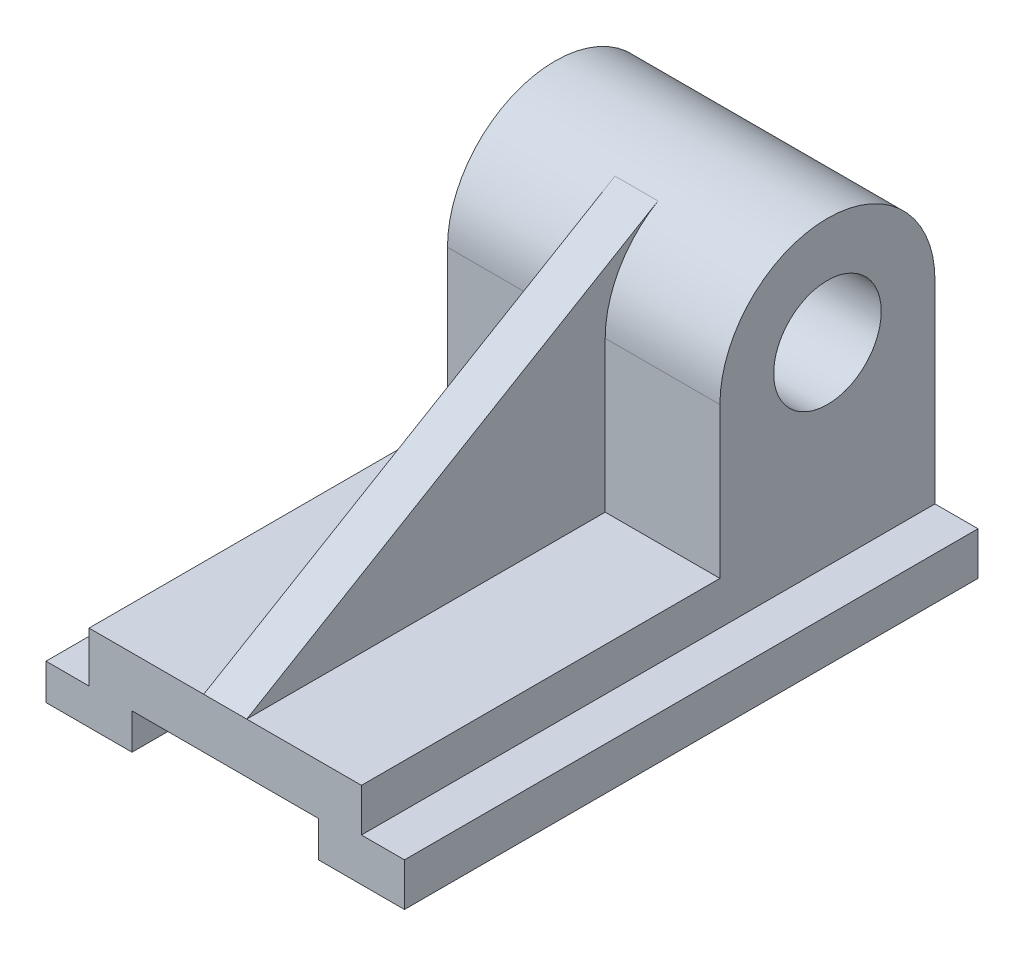
ISO-10303-21;
HEADER;
FILE_DESCRIPTION(('STEP AP214'),'2;1');
FILE_NAME('part.step','',(''),(''),'','','');
FILE_SCHEMA(('AUTOMOTIVE_DESIGN { 1 0 10303 214 1 1 1 1 }'));
ENDSEC;
DATA;
#1=APPLICATION_CONTEXT('core data for automotive mechanical design processes');
#2=APPLICATION_PROTOCOL_DEFINITION('international standard','automotive_design',2000,#1);
#3=PRODUCT_CONTEXT('',#1,'mechanical');
#4=PRODUCT('Part','Part','',(#3));
#5=PRODUCT_RELATED_PRODUCT_CATEGORY('part','',(#4));
#6=PRODUCT_DEFINITION_FORMATION('','',#4);
#7=PRODUCT_DEFINITION_CONTEXT('part definition',#1,'design');
#8=PRODUCT_DEFINITION('design','',#6,#7);
#9=PRODUCT_DEFINITION_SHAPE('','',#8);
#10=(LENGTH_UNIT() NAMED_UNIT(*) SI_UNIT(.MILLI.,.METRE.));
#11=(NAMED_UNIT(*) PLANE_ANGLE_UNIT() SI_UNIT($,.RADIAN.));
#12=(NAMED_UNIT(*) SI_UNIT($,.STERADIAN.) SOLID_ANGLE_UNIT());
#13=UNCERTAINTY_MEASURE_WITH_UNIT(LENGTH_MEASURE(1.E-05),#10,'distance_accuracy_value','');
#14=(GEOMETRIC_REPRESENTATION_CONTEXT(3) GLOBAL_UNCERTAINTY_ASSIGNED_CONTEXT((#13)) GLOBAL_UNIT_ASSIGNED_CONTEXT((#10,
#11,#12)) REPRESENTATION_CONTEXT('',''));
#15=CARTESIAN_POINT('',(0.,0.,0.));
#16=DIRECTION('',(0.,0.,1.));
#17=DIRECTION('',(1.,0.,0.));
#18=AXIS2_PLACEMENT_3D('',#15,#16,#17);
#19=CARTESIAN_POINT('',(-38.,14.,160.));
#20=DIRECTION('',(0.,-1.,0.));
#21=DIRECTION('',(0.,0.,-1.));
#22=AXIS2_PLACEMENT_3D('',#19,#20,#21);
#23=PLANE('',#22);
#24=DIRECTION('',(0.,0.,1.));
#25=VECTOR('',#24,1.);
#26=CARTESIAN_POINT('',(-6.,14.,160.));
#27=LINE('',#26,#25);
#28=CARTESIAN_POINT('',(-6.,14.,60.));
#29=VERTEX_POINT('',#28);
#30=CARTESIAN_POINT('',(-6.,14.,160.));
#31=VERTEX_POINT('',#30);
#32=EDGE_CURVE('E180',#29,#31,#27,.T.);
#33=ORIENTED_EDGE('',*,*,#32,.F.);
#34=DIRECTION('',(1.,0.,0.));
#35=VECTOR('',#34,1.);
#36=CARTESIAN_POINT('',(-38.,14.,60.));
#37=LINE('',#36,#35);
#38=CARTESIAN_POINT('',(-38.,14.,60.));
#39=VERTEX_POINT('',#38);
#40=EDGE_CURVE('E165',#39,#29,#37,.T.);
#41=ORIENTED_EDGE('',*,*,#40,.F.);
#42=DIRECTION('',(0.,0.,-1.));
#43=VECTOR('',#42,1.);
#44=CARTESIAN_POINT('',(-38.,14.,160.));
#45=LINE('',#44,#43);
#46=CARTESIAN_POINT('',(-38.,14.,160.));
#47=VERTEX_POINT('',#46);
#48=EDGE_CURVE('E314',#47,#39,#45,.T.);
#49=ORIENTED_EDGE('',*,*,#48,.F.);
#50=DIRECTION('',(-1.,0.,0.));
#51=VECTOR('',#50,1.);
#52=CARTESIAN_POINT('',(-38.,14.,160.));
#53=LINE('',#52,#51);
#54=EDGE_CURVE('E181',#31,#47,#53,.T.);
#55=ORIENTED_EDGE('',*,*,#54,.F.);
#56=EDGE_LOOP('',(#33,#41,#49,#55));
#57=FACE_BOUND('',#56,.T.);
#58=ADVANCED_FACE('F41',(#57),#23,.F.);
#59=CARTESIAN_POINT('',(-38.,14.,60.));
#60=DIRECTION('',(0.,0.,-1.));
#61=DIRECTION('',(-1.,0.,0.));
#62=AXIS2_PLACEMENT_3D('',#59,#60,#61);
#63=PLANE('',#62);
#64=DIRECTION('',(0.,-1.,0.));
#65=VECTOR('',#64,1.);
#66=CARTESIAN_POINT('',(-6.,14.,60.));
#67=LINE('',#66,#65);
#68=CARTESIAN_POINT('',(-6.,56.,60.));
#69=VERTEX_POINT('',#68);
#70=EDGE_CURVE('E169',#69,#29,#67,.T.);
#71=ORIENTED_EDGE('',*,*,#70,.F.);
#72=DIRECTION('',(-1.,0.,0.));
#73=VECTOR('',#72,1.);
#74=CARTESIAN_POINT('',(-38.,55.9999999999999,60.));
#75=LINE('',#74,#73);
#76=CARTESIAN_POINT('',(-38.,55.9999999999999,60.));
#77=VERTEX_POINT('',#76);
#78=EDGE_CURVE('E348',#69,#77,#75,.T.);
#79=ORIENTED_EDGE('',*,*,#78,.T.);
#80=DIRECTION('',(0.,1.,0.));
#81=VECTOR('',#80,1.);
#82=CARTESIAN_POINT('',(-38.,14.,60.));
#83=LINE('',#82,#81);
#84=EDGE_CURVE('E171',#39,#77,#83,.T.);
#85=ORIENTED_EDGE('',*,*,#84,.F.);
#86=ORIENTED_EDGE('',*,*,#40,.T.);
#87=EDGE_LOOP('',(#71,#79,#85,#86));
#88=FACE_BOUND('',#87,.T.);
#89=ADVANCED_FACE('F167',(#88),#63,.F.);
#90=CARTESIAN_POINT('',(-38.,55.9999999999999,30.));
#91=DIRECTION('',(1.,0.,0.));
#92=DIRECTION('',(0.,1.,0.));
#93=AXIS2_PLACEMENT_3D('',#90,#91,#92);
#94=CYLINDRICAL_SURFACE('',#93,30.);
#95=CARTESIAN_POINT('',(38.,56.,30.));
#96=DIRECTION('',(-1.,0.,0.));
#97=DIRECTION('',(0.,0.,1.));
#98=AXIS2_PLACEMENT_3D('',#95,#96,#97);
#99=CIRCLE('',#98,30.);
#100=CARTESIAN_POINT('',(38.,56.,0.));
#101=VERTEX_POINT('',#100);
#102=CARTESIAN_POINT('',(38.,56.,60.));
#103=VERTEX_POINT('',#102);
#104=EDGE_CURVE('E11',#101,#103,#99,.F.);
#105=ORIENTED_EDGE('',*,*,#104,.F.);
#106=DIRECTION('',(1.,0.,0.));
#107=VECTOR('',#106,1.);
#108=CARTESIAN_POINT('',(0.,56.,0.));
#109=LINE('',#108,#107);
#110=CARTESIAN_POINT('',(-38.,55.9999999999999,0.));
#111=VERTEX_POINT('',#110);
#112=EDGE_CURVE('E345',#111,#101,#109,.T.);
#113=ORIENTED_EDGE('',*,*,#112,.F.);
#114=CARTESIAN_POINT('',(-38.,55.9999999999999,30.));
#115=DIRECTION('',(1.,0.,0.));
#116=DIRECTION('',(0.,1.,0.));
#117=AXIS2_PLACEMENT_3D('',#114,#115,#116);
#118=CIRCLE('',#117,30.);
#119=EDGE_CURVE('E51',#77,#111,#118,.F.);
#120=ORIENTED_EDGE('',*,*,#119,.F.);
#121=ORIENTED_EDGE('',*,*,#78,.F.);
#122=CARTESIAN_POINT('',(-6.,56.,30.));
#123=DIRECTION('',(1.,0.,0.));
#124=DIRECTION('',(0.,0.,-1.));
#125=AXIS2_PLACEMENT_3D('',#122,#123,#124);
#126=CIRCLE('',#125,30.);
#127=CARTESIAN_POINT('',(-6.,81.8250354127861,45.2665499025924));
#128=VERTEX_POINT('',#127);
#129=EDGE_CURVE('E63',#69,#128,#126,.F.);
#130=ORIENTED_EDGE('',*,*,#129,.T.);
#131=DIRECTION('',(1.,0.,0.));
#132=VECTOR('',#131,1.);
#133=CARTESIAN_POINT('',(-38.,81.825035412786,45.2665499025924));
#134=LINE('',#133,#132);
#135=CARTESIAN_POINT('',(6.,81.8250354127861,45.2665499025924));
#136=VERTEX_POINT('',#135);
#137=EDGE_CURVE('E58',#136,#128,#134,.F.);
#138=ORIENTED_EDGE('',*,*,#137,.F.);
#139=CARTESIAN_POINT('',(6.,56.,30.));
#140=DIRECTION('',(1.,0.,0.));
#141=DIRECTION('',(0.,0.,-1.));
#142=AXIS2_PLACEMENT_3D('',#139,#140,#141);
#143=CIRCLE('',#142,30.);
#144=CARTESIAN_POINT('',(6.,56.,60.));
#145=VERTEX_POINT('',#144);
#146=EDGE_CURVE('E206',#145,#136,#143,.F.);
#147=ORIENTED_EDGE('',*,*,#146,.F.);
#148=EDGE_CURVE('E349',#103,#145,#75,.T.);
#149=ORIENTED_EDGE('',*,*,#148,.F.);
#150=EDGE_LOOP('',(#105,#113,#120,#121,#130,#138,#147,#149));
#151=FACE_BOUND('',#150,.T.);
#152=ADVANCED_FACE('F44',(#151),#94,.T.);
#153=CARTESIAN_POINT('',(6.,14.,60.));
#154=VERTEX_POINT('',#153);
#155=CARTESIAN_POINT('',(38.,14.,60.));
#156=VERTEX_POINT('',#155);
#157=EDGE_CURVE('E177',#154,#156,#37,.T.);
#158=ORIENTED_EDGE('',*,*,#157,.F.);
#159=DIRECTION('',(0.,0.,1.));
#160=VECTOR('',#159,1.);
#161=CARTESIAN_POINT('',(6.,14.,160.));
#162=LINE('',#161,#160);
#163=CARTESIAN_POINT('',(6.,14.,160.));
#164=VERTEX_POINT('',#163);
#165=EDGE_CURVE('E203',#154,#164,#162,.T.);
#166=ORIENTED_EDGE('',*,*,#165,.T.);
#167=CARTESIAN_POINT('',(38.,14.,160.));
#168=VERTEX_POINT('',#167);
#169=EDGE_CURVE('E248',#168,#164,#53,.T.);
#170=ORIENTED_EDGE('',*,*,#169,.F.);
#171=DIRECTION('',(0.,0.,-1.));
#172=VECTOR('',#171,1.);
#173=CARTESIAN_POINT('',(38.,14.,160.));
#174=LINE('',#173,#172);
#175=EDGE_CURVE('E317',#168,#156,#174,.T.);
#176=ORIENTED_EDGE('',*,*,#175,.T.);
#177=EDGE_LOOP('',(#158,#166,#170,#176));
#178=FACE_BOUND('',#177,.T.);
#179=ADVANCED_FACE('F395',(#178),#23,.F.);
#180=CARTESIAN_POINT('',(-26.,1.76616533897889E-13,160.));
#181=DIRECTION('',(-1.,0.,0.));
#182=DIRECTION('',(0.,0.,1.));
#183=AXIS2_PLACEMENT_3D('',#180,#181,#182);
#184=PLANE('',#183);
#185=DIRECTION('',(0.,1.,0.));
#186=VECTOR('',#185,1.);
#187=CARTESIAN_POINT('',(-26.,1.76616533897889E-13,0.));
#188=LINE('',#187,#186);
#189=CARTESIAN_POINT('',(-26.,-9.99999999999982,0.));
#190=VERTEX_POINT('',#189);
#191=CARTESIAN_POINT('',(-26.,1.76616533897889E-13,0.));
#192=VERTEX_POINT('',#191);
#193=EDGE_CURVE('E176',#190,#192,#188,.T.);
#194=ORIENTED_EDGE('',*,*,#193,.T.);
#195=DIRECTION('',(0.,0.,-1.));
#196=VECTOR('',#195,1.);
#197=CARTESIAN_POINT('',(-26.,1.76616533897889E-13,160.));
#198=LINE('',#197,#196);
#199=CARTESIAN_POINT('',(-26.,1.76616533897889E-13,160.));
#200=VERTEX_POINT('',#199);
#201=EDGE_CURVE('E341',#200,#192,#198,.T.);
#202=ORIENTED_EDGE('',*,*,#201,.F.);
#203=DIRECTION('',(0.,1.,0.));
#204=VECTOR('',#203,1.);
#205=CARTESIAN_POINT('',(-26.,1.76616533897889E-13,160.));
#206=LINE('',#205,#204);
#207=CARTESIAN_POINT('',(-26.,-9.99999999999982,160.));
#208=VERTEX_POINT('',#207);
#209=EDGE_CURVE('E225',#208,#200,#206,.T.);
#210=ORIENTED_EDGE('',*,*,#209,.F.);
#211=DIRECTION('',(0.,0.,-1.));
#212=VECTOR('',#211,1.);
#213=CARTESIAN_POINT('',(-26.,-9.99999999999982,160.));
#214=LINE('',#213,#212);
#215=EDGE_CURVE('E265',#208,#190,#214,.T.);
#216=ORIENTED_EDGE('',*,*,#215,.T.);
#217=EDGE_LOOP('',(#194,#202,#210,#216));
#218=FACE_BOUND('',#217,.T.);
#219=ADVANCED_FACE('F425',(#218),#184,.F.);
#220=CARTESIAN_POINT('',(26.,-1.66858714345519E-13,160.));
#221=DIRECTION('',(0.,1.,0.));
#222=DIRECTION('',(-1.,0.,0.));
#223=AXIS2_PLACEMENT_3D('',#220,#221,#222);
#224=PLANE('',#223);
#225=DIRECTION('',(0.,0.,-1.));
#226=VECTOR('',#225,1.);
#227=CARTESIAN_POINT('',(26.,-1.66858714345519E-13,160.));
#228=LINE('',#227,#226);
#229=CARTESIAN_POINT('',(26.,-1.66858714345519E-13,160.));
#230=VERTEX_POINT('',#229);
#231=CARTESIAN_POINT('',(26.,-1.66858714345519E-13,0.));
#232=VERTEX_POINT('',#231);
#233=EDGE_CURVE('E337',#230,#232,#228,.T.);
#234=ORIENTED_EDGE('',*,*,#233,.F.);
#235=DIRECTION('',(1.,0.,0.));
#236=VECTOR('',#235,1.);
#237=CARTESIAN_POINT('',(26.,-1.66858714345519E-13,160.));
#238=LINE('',#237,#236);
#239=EDGE_CURVE('E229',#200,#230,#238,.T.);
#240=ORIENTED_EDGE('',*,*,#239,.F.);
#241=ORIENTED_EDGE('',*,*,#201,.T.);
#242=DIRECTION('',(1.,0.,0.));
#243=VECTOR('',#242,1.);
#244=CARTESIAN_POINT('',(26.,-1.66858714345519E-13,0.));
#245=LINE('',#244,#243);
#246=EDGE_CURVE('E269',#192,#232,#245,.T.);
#247=ORIENTED_EDGE('',*,*,#246,.T.);
#248=EDGE_LOOP('',(#234,#240,#241,#247));
#249=FACE_BOUND('',#248,.T.);
#250=ADVANCED_FACE('F430',(#249),#224,.F.);
#251=CARTESIAN_POINT('',(26.,-10.,160.));
#252=DIRECTION('',(1.,0.,0.));
#253=DIRECTION('',(0.,0.,-1.));
#254=AXIS2_PLACEMENT_3D('',#251,#252,#253);
#255=PLANE('',#254);
#256=DIRECTION('',(0.,-1.,0.));
#257=VECTOR('',#256,1.);
#258=CARTESIAN_POINT('',(26.,-10.,0.));
#259=LINE('',#258,#257);
#260=CARTESIAN_POINT('',(26.,-10.,0.));
#261=VERTEX_POINT('',#260);
#262=EDGE_CURVE('E272',#232,#261,#259,.T.);
#263=ORIENTED_EDGE('',*,*,#262,.T.);
#264=DIRECTION('',(0.,0.,-1.));
#265=VECTOR('',#264,1.);
#266=CARTESIAN_POINT('',(26.,-10.,160.));
#267=LINE('',#266,#265);
#268=CARTESIAN_POINT('',(26.,-10.,160.));
#269=VERTEX_POINT('',#268);
#270=EDGE_CURVE('E333',#269,#261,#267,.T.);
#271=ORIENTED_EDGE('',*,*,#270,.F.);
#272=DIRECTION('',(0.,-1.,0.));
#273=VECTOR('',#272,1.);
#274=CARTESIAN_POINT('',(26.,-10.,160.));
#275=LINE('',#274,#273);
#276=EDGE_CURVE('E233',#230,#269,#275,.T.);
#277=ORIENTED_EDGE('',*,*,#276,.F.);
#278=ORIENTED_EDGE('',*,*,#233,.T.);
#279=EDGE_LOOP('',(#263,#271,#277,#278));
#280=FACE_BOUND('',#279,.T.);
#281=ADVANCED_FACE('F522',(#280),#255,.F.);
#282=CARTESIAN_POINT('',(50.,-9.99999999999999,160.));
#283=DIRECTION('',(0.,1.,0.));
#284=DIRECTION('',(-1.,0.,0.));
#285=AXIS2_PLACEMENT_3D('',#282,#283,#284);
#286=PLANE('',#285);
#287=DIRECTION('',(1.,0.,0.));
#288=VECTOR('',#287,1.);
#289=CARTESIAN_POINT('',(50.,-9.99999999999999,0.));
#290=LINE('',#289,#288);
#291=CARTESIAN_POINT('',(50.,-9.99999999999999,0.));
#292=VERTEX_POINT('',#291);
#293=EDGE_CURVE('E275',#261,#292,#290,.T.);
#294=ORIENTED_EDGE('',*,*,#293,.T.);
#295=DIRECTION('',(0.,0.,-1.));
#296=VECTOR('',#295,1.);
#297=CARTESIAN_POINT('',(50.,-9.99999999999999,160.));
#298=LINE('',#297,#296);
#299=CARTESIAN_POINT('',(50.,-9.99999999999999,160.));
#300=VERTEX_POINT('',#299);
#301=EDGE_CURVE('E329',#300,#292,#298,.T.);
#302=ORIENTED_EDGE('',*,*,#301,.F.);
#303=DIRECTION('',(1.,0.,0.));
#304=VECTOR('',#303,1.);
#305=CARTESIAN_POINT('',(50.,-9.99999999999999,160.));
#306=LINE('',#305,#304);
#307=EDGE_CURVE('E236',#269,#300,#306,.T.);
#308=ORIENTED_EDGE('',*,*,#307,.F.);
#309=ORIENTED_EDGE('',*,*,#270,.T.);
#310=EDGE_LOOP('',(#294,#302,#308,#309));
#311=FACE_BOUND('',#310,.T.);
#312=ADVANCED_FACE('F512',(#311),#286,.F.);
#313=CARTESIAN_POINT('',(50.,2.00000000000001,160.));
#314=DIRECTION('',(-1.,0.,0.));
#315=DIRECTION('',(0.,-1.,0.));
#316=AXIS2_PLACEMENT_3D('',#313,#314,#315);
#317=PLANE('',#316);
#318=DIRECTION('',(0.,1.,0.));
#319=VECTOR('',#318,1.);
#320=CARTESIAN_POINT('',(50.,2.00000000000001,0.));
#321=LINE('',#320,#319);
#322=CARTESIAN_POINT('',(50.,2.00000000000001,0.));
#323=VERTEX_POINT('',#322);
#324=EDGE_CURVE('E278',#292,#323,#321,.T.);
#325=ORIENTED_EDGE('',*,*,#324,.T.);
#326=DIRECTION('',(0.,0.,-1.));
#327=VECTOR('',#326,1.);
#328=CARTESIAN_POINT('',(50.,2.00000000000001,160.));
#329=LINE('',#328,#327);
#330=CARTESIAN_POINT('',(50.,2.00000000000001,160.));
#331=VERTEX_POINT('',#330);
#332=EDGE_CURVE('E325',#331,#323,#329,.T.);
#333=ORIENTED_EDGE('',*,*,#332,.F.);
#334=DIRECTION('',(0.,1.,0.));
#335=VECTOR('',#334,1.);
#336=CARTESIAN_POINT('',(50.,2.00000000000001,160.));
#337=LINE('',#336,#335);
#338=EDGE_CURVE('E239',#300,#331,#337,.T.);
#339=ORIENTED_EDGE('',*,*,#338,.F.);
#340=ORIENTED_EDGE('',*,*,#301,.T.);
#341=EDGE_LOOP('',(#325,#333,#339,#340));
#342=FACE_BOUND('',#341,.T.);
#343=ADVANCED_FACE('F502',(#342),#317,.F.);
#344=CARTESIAN_POINT('',(38.,2.00000000000001,160.));
#345=DIRECTION('',(0.,-1.,0.));
#346=DIRECTION('',(0.,0.,-1.));
#347=AXIS2_PLACEMENT_3D('',#344,#345,#346);
#348=PLANE('',#347);
#349=DIRECTION('',(-1.,0.,0.));
#350=VECTOR('',#349,1.);
#351=CARTESIAN_POINT('',(38.,2.00000000000001,0.));
#352=LINE('',#351,#350);
#353=CARTESIAN_POINT('',(38.,2.00000000000001,0.));
#354=VERTEX_POINT('',#353);
#355=EDGE_CURVE('E281',#323,#354,#352,.T.);
#356=ORIENTED_EDGE('',*,*,#355,.T.);
#357=DIRECTION('',(0.,0.,-1.));
#358=VECTOR('',#357,1.);
#359=CARTESIAN_POINT('',(38.,2.00000000000001,160.));
#360=LINE('',#359,#358);
#361=CARTESIAN_POINT('',(38.,2.00000000000001,160.));
#362=VERTEX_POINT('',#361);
#363=EDGE_CURVE('E321',#362,#354,#360,.T.);
#364=ORIENTED_EDGE('',*,*,#363,.F.);
#365=DIRECTION('',(-1.,0.,0.));
#366=VECTOR('',#365,1.);
#367=CARTESIAN_POINT('',(38.,2.00000000000001,160.));
#368=LINE('',#367,#366);
#369=EDGE_CURVE('E242',#331,#362,#368,.T.);
#370=ORIENTED_EDGE('',*,*,#369,.F.);
#371=ORIENTED_EDGE('',*,*,#332,.T.);
#372=EDGE_LOOP('',(#356,#364,#370,#371));
#373=FACE_BOUND('',#372,.T.);
#374=ADVANCED_FACE('F464',(#373),#348,.F.);
#375=CARTESIAN_POINT('',(38.,14.,160.));
#376=DIRECTION('',(-1.,0.,0.));
#377=DIRECTION('',(0.,0.,1.));
#378=AXIS2_PLACEMENT_3D('',#375,#376,#377);
#379=PLANE('',#378);
#380=CARTESIAN_POINT('',(38.,56.,30.));
#381=DIRECTION('',(1.,0.,0.));
#382=DIRECTION('',(0.,0.,-1.));
#383=AXIS2_PLACEMENT_3D('',#380,#381,#382);
#384=CIRCLE('',#383,15.);
#385=CARTESIAN_POINT('',(38.,56.,15.));
#386=VERTEX_POINT('',#385);
#387=EDGE_CURVE('E211',#386,#386,#384,.T.);
#388=ORIENTED_EDGE('',*,*,#387,.F.);
#389=EDGE_LOOP('',(#388));
#390=FACE_BOUND('',#389,.T.);
#391=DIRECTION('',(0.,1.,0.));
#392=VECTOR('',#391,1.);
#393=CARTESIAN_POINT('',(38.,14.,0.));
#394=LINE('',#393,#392);
#395=EDGE_CURVE('E284',#354,#101,#394,.T.);
#396=ORIENTED_EDGE('',*,*,#395,.T.);
#397=ORIENTED_EDGE('',*,*,#104,.T.);
#398=DIRECTION('',(0.,1.,0.));
#399=VECTOR('',#398,1.);
#400=CARTESIAN_POINT('',(38.,14.,60.));
#401=LINE('',#400,#399);
#402=EDGE_CURVE('E216',#156,#103,#401,.T.);
#403=ORIENTED_EDGE('',*,*,#402,.F.);
#404=ORIENTED_EDGE('',*,*,#175,.F.);
#405=DIRECTION('',(0.,1.,0.));
#406=VECTOR('',#405,1.);
#407=CARTESIAN_POINT('',(38.,14.,160.));
#408=LINE('',#407,#406);
#409=EDGE_CURVE('E245',#362,#168,#408,.T.);
#410=ORIENTED_EDGE('',*,*,#409,.F.);
#411=ORIENTED_EDGE('',*,*,#363,.T.);
#412=EDGE_LOOP('',(#396,#397,#403,#404,#410,#411));
#413=FACE_BOUND('',#412,.T.);
#414=ADVANCED_FACE('F398',(#390,#413),#379,.F.);
#415=CARTESIAN_POINT('',(-38.,0.,160.));
#416=DIRECTION('',(1.,0.,0.));
#417=DIRECTION('',(0.,1.,0.));
#418=AXIS2_PLACEMENT_3D('',#415,#416,#417);
#419=PLANE('',#418);
#420=CARTESIAN_POINT('',(-38.,56.,30.));
#421=DIRECTION('',(1.,0.,0.));
#422=DIRECTION('',(0.,0.,-1.));
#423=AXIS2_PLACEMENT_3D('',#420,#421,#422);
#424=CIRCLE('',#423,15.);
#425=CARTESIAN_POINT('',(-38.,56.,15.));
#426=VERTEX_POINT('',#425);
#427=EDGE_CURVE('E212',#426,#426,#424,.T.);
#428=ORIENTED_EDGE('',*,*,#427,.T.);
#429=EDGE_LOOP('',(#428));
#430=FACE_BOUND('',#429,.T.);
#431=ORIENTED_EDGE('',*,*,#84,.T.);
#432=ORIENTED_EDGE('',*,*,#119,.T.);
#433=DIRECTION('',(0.,-1.,0.));
#434=VECTOR('',#433,1.);
#435=CARTESIAN_POINT('',(-38.,0.,0.));
#436=LINE('',#435,#434);
#437=CARTESIAN_POINT('',(-38.,0.,0.));
#438=VERTEX_POINT('',#437);
#439=EDGE_CURVE('E288',#111,#438,#436,.T.);
#440=ORIENTED_EDGE('',*,*,#439,.T.);
#441=DIRECTION('',(0.,0.,-1.));
#442=VECTOR('',#441,1.);
#443=CARTESIAN_POINT('',(-38.,0.,160.));
#444=LINE('',#443,#442);
#445=CARTESIAN_POINT('',(-38.,0.,160.));
#446=VERTEX_POINT('',#445);
#447=EDGE_CURVE('E310',#446,#438,#444,.T.);
#448=ORIENTED_EDGE('',*,*,#447,.F.);
#449=DIRECTION('',(0.,-1.,0.));
#450=VECTOR('',#449,1.);
#451=CARTESIAN_POINT('',(-38.,0.,160.));
#452=LINE('',#451,#450);
#453=EDGE_CURVE('E252',#47,#446,#452,.T.);
#454=ORIENTED_EDGE('',*,*,#453,.F.);
#455=ORIENTED_EDGE('',*,*,#48,.T.);
#456=EDGE_LOOP('',(#431,#432,#440,#448,#454,#455));
#457=FACE_BOUND('',#456,.T.);
#458=ADVANCED_FACE('F356',(#430,#457),#419,.F.);
#459=CARTESIAN_POINT('',(-50.,1.76616533897889E-13,160.));
#460=DIRECTION('',(0.,-1.,0.));
#461=DIRECTION('',(1.,0.,0.));
#462=AXIS2_PLACEMENT_3D('',#459,#460,#461);
#463=PLANE('',#462);
#464=DIRECTION('',(-1.,0.,0.));
#465=VECTOR('',#464,1.);
#466=CARTESIAN_POINT('',(-50.,1.76616533897889E-13,0.));
#467=LINE('',#466,#465);
#468=CARTESIAN_POINT('',(-50.,1.76616533897889E-13,0.));
#469=VERTEX_POINT('',#468);
#470=EDGE_CURVE('E291',#438,#469,#467,.T.);
#471=ORIENTED_EDGE('',*,*,#470,.T.);
#472=DIRECTION('',(0.,0.,-1.));
#473=VECTOR('',#472,1.);
#474=CARTESIAN_POINT('',(-50.,1.76616533897889E-13,160.));
#475=LINE('',#474,#473);
#476=CARTESIAN_POINT('',(-50.,1.76616533897889E-13,160.));
#477=VERTEX_POINT('',#476);
#478=EDGE_CURVE('E306',#477,#469,#475,.T.);
#479=ORIENTED_EDGE('',*,*,#478,.F.);
#480=DIRECTION('',(-1.,0.,0.));
#481=VECTOR('',#480,1.);
#482=CARTESIAN_POINT('',(-50.,1.76616533897889E-13,160.));
#483=LINE('',#482,#481);
#484=EDGE_CURVE('E256',#446,#477,#483,.T.);
#485=ORIENTED_EDGE('',*,*,#484,.F.);
#486=ORIENTED_EDGE('',*,*,#447,.T.);
#487=EDGE_LOOP('',(#471,#479,#485,#486));
#488=FACE_BOUND('',#487,.T.);
#489=ADVANCED_FACE('F370',(#488),#463,.F.);
#490=CARTESIAN_POINT('',(-50.,-9.99999999999983,160.));
#491=DIRECTION('',(1.,0.,0.));
#492=DIRECTION('',(0.,0.,-1.));
#493=AXIS2_PLACEMENT_3D('',#490,#491,#492);
#494=PLANE('',#493);
#495=DIRECTION('',(0.,-1.,0.));
#496=VECTOR('',#495,1.);
#497=CARTESIAN_POINT('',(-50.,-9.99999999999983,0.));
#498=LINE('',#497,#496);
#499=CARTESIAN_POINT('',(-50.,-9.99999999999983,0.));
#500=VERTEX_POINT('',#499);
#501=EDGE_CURVE('E294',#469,#500,#498,.T.);
#502=ORIENTED_EDGE('',*,*,#501,.T.);
#503=DIRECTION('',(0.,0.,-1.));
#504=VECTOR('',#503,1.);
#505=CARTESIAN_POINT('',(-50.,-9.99999999999983,160.));
#506=LINE('',#505,#504);
#507=CARTESIAN_POINT('',(-50.,-9.99999999999983,160.));
#508=VERTEX_POINT('',#507);
#509=EDGE_CURVE('E302',#508,#500,#506,.T.);
#510=ORIENTED_EDGE('',*,*,#509,.F.);
#511=DIRECTION('',(0.,-1.,0.));
#512=VECTOR('',#511,1.);
#513=CARTESIAN_POINT('',(-50.,-9.99999999999983,160.));
#514=LINE('',#513,#512);
#515=EDGE_CURVE('E259',#477,#508,#514,.T.);
#516=ORIENTED_EDGE('',*,*,#515,.F.);
#517=ORIENTED_EDGE('',*,*,#478,.T.);
#518=EDGE_LOOP('',(#502,#510,#516,#517));
#519=FACE_BOUND('',#518,.T.);
#520=ADVANCED_FACE('F374',(#519),#494,.F.);
#521=CARTESIAN_POINT('',(-26.,-9.99999999999982,160.));
#522=DIRECTION('',(0.,1.,0.));
#523=DIRECTION('',(-1.,0.,0.));
#524=AXIS2_PLACEMENT_3D('',#521,#522,#523);
#525=PLANE('',#524);
#526=DIRECTION('',(1.,0.,0.));
#527=VECTOR('',#526,1.);
#528=CARTESIAN_POINT('',(-26.,-9.99999999999982,0.));
#529=LINE('',#528,#527);
#530=EDGE_CURVE('E230',#500,#190,#529,.T.);
#531=ORIENTED_EDGE('',*,*,#530,.T.);
#532=ORIENTED_EDGE('',*,*,#215,.F.);
#533=DIRECTION('',(1.,0.,0.));
#534=VECTOR('',#533,1.);
#535=CARTESIAN_POINT('',(-26.,-9.99999999999982,160.));
#536=LINE('',#535,#534);
#537=EDGE_CURVE('E262',#508,#208,#536,.T.);
#538=ORIENTED_EDGE('',*,*,#537,.F.);
#539=ORIENTED_EDGE('',*,*,#509,.T.);
#540=EDGE_LOOP('',(#531,#532,#538,#539));
#541=FACE_BOUND('',#540,.T.);
#542=ADVANCED_FACE('F472',(#541),#525,.F.);
#543=CARTESIAN_POINT('',(0.,0.,160.));
#544=DIRECTION('',(0.,0.,-1.));
#545=DIRECTION('',(-1.,0.,0.));
#546=AXIS2_PLACEMENT_3D('',#543,#544,#545);
#547=PLANE('',#546);
#548=ORIENTED_EDGE('',*,*,#169,.T.);
#549=EDGE_CURVE('E253',#164,#31,#53,.T.);
#550=ORIENTED_EDGE('',*,*,#549,.T.);
#551=ORIENTED_EDGE('',*,*,#54,.T.);
#552=ORIENTED_EDGE('',*,*,#453,.T.);
#553=ORIENTED_EDGE('',*,*,#484,.T.);
#554=ORIENTED_EDGE('',*,*,#515,.T.);
#555=ORIENTED_EDGE('',*,*,#537,.T.);
#556=ORIENTED_EDGE('',*,*,#209,.T.);
#557=ORIENTED_EDGE('',*,*,#239,.T.);
#558=ORIENTED_EDGE('',*,*,#276,.T.);
#559=ORIENTED_EDGE('',*,*,#307,.T.);
#560=ORIENTED_EDGE('',*,*,#338,.T.);
#561=ORIENTED_EDGE('',*,*,#369,.T.);
#562=ORIENTED_EDGE('',*,*,#409,.T.);
#563=EDGE_LOOP('',(#548,#550,#551,#552,#553,#554,#555,#556,#557,#558,#559,#560,#561,#562));
#564=FACE_BOUND('',#563,.T.);
#565=ADVANCED_FACE('F378',(#564),#547,.F.);
#566=CARTESIAN_POINT('',(0.,0.,0.));
#567=DIRECTION('',(0.,0.,-1.));
#568=DIRECTION('',(-1.,0.,0.));
#569=AXIS2_PLACEMENT_3D('',#566,#567,#568);
#570=PLANE('',#569);
#571=ORIENTED_EDGE('',*,*,#262,.F.);
#572=ORIENTED_EDGE('',*,*,#246,.F.);
#573=ORIENTED_EDGE('',*,*,#193,.F.);
#574=ORIENTED_EDGE('',*,*,#530,.F.);
#575=ORIENTED_EDGE('',*,*,#501,.F.);
#576=ORIENTED_EDGE('',*,*,#470,.F.);
#577=ORIENTED_EDGE('',*,*,#439,.F.);
#578=ORIENTED_EDGE('',*,*,#112,.T.);
#579=ORIENTED_EDGE('',*,*,#395,.F.);
#580=ORIENTED_EDGE('',*,*,#355,.F.);
#581=ORIENTED_EDGE('',*,*,#324,.F.);
#582=ORIENTED_EDGE('',*,*,#293,.F.);
#583=EDGE_LOOP('',(#571,#572,#573,#574,#575,#576,#577,#578,#579,#580,#581,#582));
#584=FACE_BOUND('',#583,.T.);
#585=ADVANCED_FACE('F365',(#584),#570,.T.);
#586=ORIENTED_EDGE('',*,*,#148,.T.);
#587=DIRECTION('',(0.,-1.,0.));
#588=VECTOR('',#587,1.);
#589=CARTESIAN_POINT('',(6.,14.,60.));
#590=LINE('',#589,#588);
#591=EDGE_CURVE('E200',#145,#154,#590,.T.);
#592=ORIENTED_EDGE('',*,*,#591,.T.);
#593=ORIENTED_EDGE('',*,*,#157,.T.);
#594=ORIENTED_EDGE('',*,*,#402,.T.);
#595=EDGE_LOOP('',(#586,#592,#593,#594));
#596=FACE_BOUND('',#595,.T.);
#597=ADVANCED_FACE('F388',(#596),#63,.F.);
#598=CARTESIAN_POINT('',(-38.,56.,30.));
#599=DIRECTION('',(1.,0.,0.));
#600=DIRECTION('',(0.,0.,-1.));
#601=AXIS2_PLACEMENT_3D('',#598,#599,#600);
#602=CYLINDRICAL_SURFACE('',#601,15.);
#603=ORIENTED_EDGE('',*,*,#387,.T.);
#604=EDGE_LOOP('',(#603));
#605=FACE_BOUND('',#604,.T.);
#606=ORIENTED_EDGE('',*,*,#427,.F.);
#607=EDGE_LOOP('',(#606));
#608=FACE_BOUND('',#607,.T.);
#609=ADVANCED_FACE('F406',(#605,#608),#602,.F.);
#610=CARTESIAN_POINT('',(0.,81.8250354127861,45.2665499025924));
#611=DIRECTION('',(0.,0.860834513759536,0.508884996753081));
#612=DIRECTION('',(0.,-0.508884996753081,0.860834513759536));
#613=AXIS2_PLACEMENT_3D('',#610,#611,#612);
#614=PLANE('',#613);
#615=DIRECTION('',(0.,-0.508884996753081,0.860834513759536));
#616=VECTOR('',#615,1.);
#617=CARTESIAN_POINT('',(6.,81.8250354127861,45.2665499025924));
#618=LINE('',#617,#616);
#619=EDGE_CURVE('E190',#136,#164,#618,.T.);
#620=ORIENTED_EDGE('',*,*,#619,.F.);
#621=ORIENTED_EDGE('',*,*,#137,.T.);
#622=DIRECTION('',(0.,-0.508884996753081,0.860834513759536));
#623=VECTOR('',#622,1.);
#624=CARTESIAN_POINT('',(-6.,81.8250354127861,45.2665499025924));
#625=LINE('',#624,#623);
#626=EDGE_CURVE('E194',#128,#31,#625,.T.);
#627=ORIENTED_EDGE('',*,*,#626,.T.);
#628=ORIENTED_EDGE('',*,*,#549,.F.);
#629=EDGE_LOOP('',(#620,#621,#627,#628));
#630=FACE_BOUND('',#629,.T.);
#631=ADVANCED_FACE('F403',(#630),#614,.T.);
#632=CARTESIAN_POINT('',(6.,38.,80.));
#633=DIRECTION('',(1.,0.,0.));
#634=DIRECTION('',(0.,0.,-1.));
#635=AXIS2_PLACEMENT_3D('',#632,#633,#634);
#636=PLANE('',#635);
#637=ORIENTED_EDGE('',*,*,#591,.F.);
#638=ORIENTED_EDGE('',*,*,#146,.T.);
#639=ORIENTED_EDGE('',*,*,#619,.T.);
#640=ORIENTED_EDGE('',*,*,#165,.F.);
#641=EDGE_LOOP('',(#637,#638,#639,#640));
#642=FACE_BOUND('',#641,.T.);
#643=ADVANCED_FACE('F400',(#642),#636,.T.);
#644=CARTESIAN_POINT('',(-6.,38.,80.));
#645=DIRECTION('',(1.,0.,0.));
#646=DIRECTION('',(0.,0.,-1.));
#647=AXIS2_PLACEMENT_3D('',#644,#645,#646);
#648=PLANE('',#647);
#649=ORIENTED_EDGE('',*,*,#129,.F.);
#650=ORIENTED_EDGE('',*,*,#70,.T.);
#651=ORIENTED_EDGE('',*,*,#32,.T.);
#652=ORIENTED_EDGE('',*,*,#626,.F.);
#653=EDGE_LOOP('',(#649,#650,#651,#652));
#654=FACE_BOUND('',#653,.T.);
#655=ADVANCED_FACE('F188',(#654),#648,.F.);
#656=CLOSED_SHELL('',(#58,#89,#152,#179,#219,#250,#281,#312,#343,#374,#414,#458,#489,#520,#542,
#565,#585,#597,#609,#631,#643,#655));
#657=MANIFOLD_SOLID_BREP('B2',#656);
#658=ADVANCED_BREP_SHAPE_REPRESENTATION('',(#18,#657),#14);
#659=SHAPE_DEFINITION_REPRESENTATION(#9,#658);
ENDSEC;
END-ISO-10303-21;
